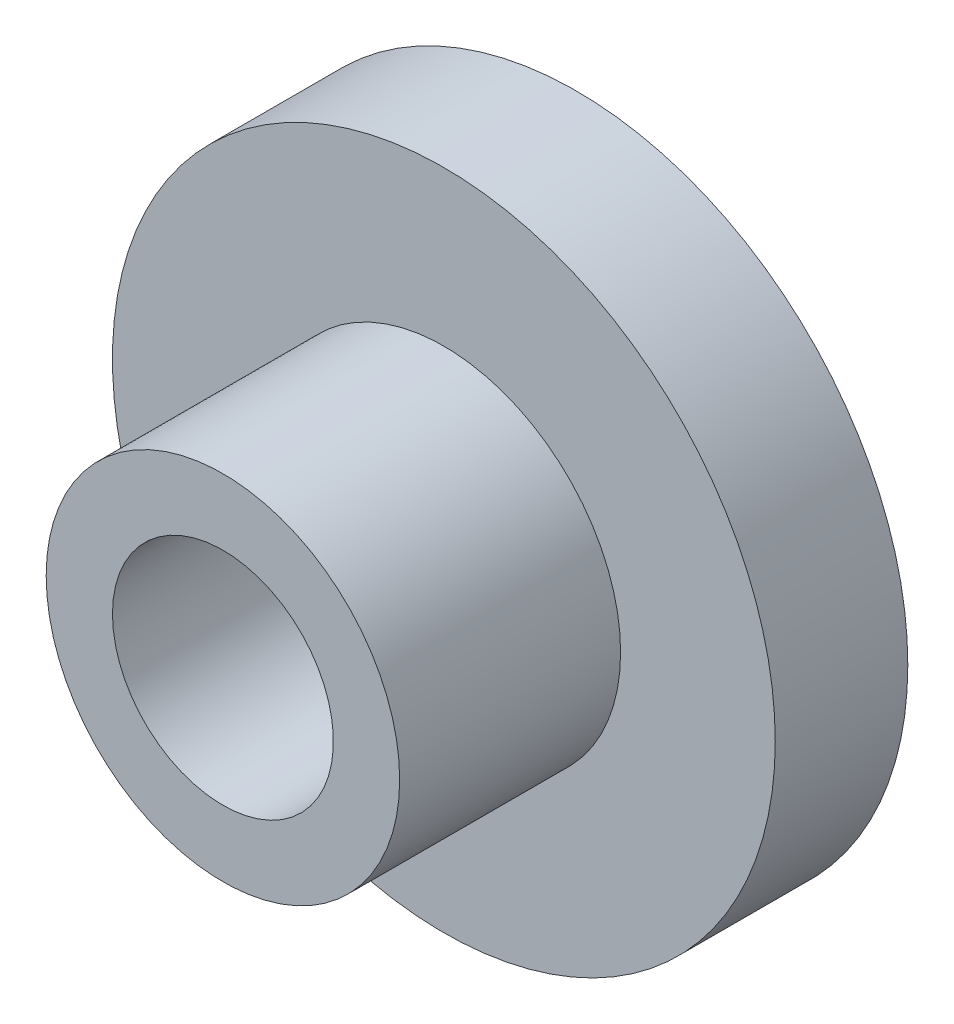
ISO-10303-21;
HEADER;
FILE_DESCRIPTION(('STEP AP214'),'2;1');
FILE_NAME('part.step','',(''),(''),'','','');
FILE_SCHEMA(('AUTOMOTIVE_DESIGN { 1 0 10303 214 1 1 1 1 }'));
ENDSEC;
DATA;
#1=APPLICATION_CONTEXT('core data for automotive mechanical design processes');
#2=APPLICATION_PROTOCOL_DEFINITION('international standard','automotive_design',2000,#1);
#3=PRODUCT_CONTEXT('',#1,'mechanical');
#4=PRODUCT('Part','Part','',(#3));
#5=PRODUCT_RELATED_PRODUCT_CATEGORY('part','',(#4));
#6=PRODUCT_DEFINITION_FORMATION('','',#4);
#7=PRODUCT_DEFINITION_CONTEXT('part definition',#1,'design');
#8=PRODUCT_DEFINITION('design','',#6,#7);
#9=PRODUCT_DEFINITION_SHAPE('','',#8);
#10=(LENGTH_UNIT() NAMED_UNIT(*) SI_UNIT(.MILLI.,.METRE.));
#11=(NAMED_UNIT(*) PLANE_ANGLE_UNIT() SI_UNIT($,.RADIAN.));
#12=(NAMED_UNIT(*) SI_UNIT($,.STERADIAN.) SOLID_ANGLE_UNIT());
#13=UNCERTAINTY_MEASURE_WITH_UNIT(LENGTH_MEASURE(1.E-05),#10,'distance_accuracy_value','');
#14=(GEOMETRIC_REPRESENTATION_CONTEXT(3) GLOBAL_UNCERTAINTY_ASSIGNED_CONTEXT((#13)) GLOBAL_UNIT_ASSIGNED_CONTEXT((#10,
#11,#12)) REPRESENTATION_CONTEXT('',''));
#15=CARTESIAN_POINT('',(0.,0.,0.));
#16=DIRECTION('',(0.,0.,1.));
#17=DIRECTION('',(1.,0.,0.));
#18=AXIS2_PLACEMENT_3D('',#15,#16,#17);
#19=CARTESIAN_POINT('',(0.,0.,3.));
#20=DIRECTION('',(0.,0.,-1.));
#21=DIRECTION('',(-1.,0.,0.));
#22=AXIS2_PLACEMENT_3D('',#19,#20,#21);
#23=CYLINDRICAL_SURFACE('',#22,7.5);
#24=CARTESIAN_POINT('',(0.,0.,3.));
#25=DIRECTION('',(0.,0.,1.));
#26=DIRECTION('',(1.,0.,0.));
#27=AXIS2_PLACEMENT_3D('',#24,#25,#26);
#28=CIRCLE('',#27,7.5);
#29=CARTESIAN_POINT('',(7.5,0.,3.));
#30=VERTEX_POINT('',#29);
#31=EDGE_CURVE('E37',#30,#30,#28,.T.);
#32=ORIENTED_EDGE('',*,*,#31,.F.);
#33=EDGE_LOOP('',(#32));
#34=FACE_BOUND('',#33,.T.);
#35=CARTESIAN_POINT('',(0.,0.,0.));
#36=DIRECTION('',(0.,0.,1.));
#37=DIRECTION('',(1.,0.,0.));
#38=AXIS2_PLACEMENT_3D('',#35,#36,#37);
#39=CIRCLE('',#38,7.5);
#40=CARTESIAN_POINT('',(7.5,0.,0.));
#41=VERTEX_POINT('',#40);
#42=EDGE_CURVE('E33',#41,#41,#39,.T.);
#43=ORIENTED_EDGE('',*,*,#42,.T.);
#44=EDGE_LOOP('',(#43));
#45=FACE_BOUND('',#44,.T.);
#46=ADVANCED_FACE('F30',(#34,#45),#23,.T.);
#47=CARTESIAN_POINT('',(0.,0.,3.));
#48=DIRECTION('',(0.,0.,1.));
#49=DIRECTION('',(1.,0.,0.));
#50=AXIS2_PLACEMENT_3D('',#47,#48,#49);
#51=PLANE('',#50);
#52=CARTESIAN_POINT('',(0.,0.,3.));
#53=DIRECTION('',(0.,0.,1.));
#54=DIRECTION('',(1.,0.,0.));
#55=AXIS2_PLACEMENT_3D('',#52,#53,#54);
#56=CIRCLE('',#55,4.);
#57=CARTESIAN_POINT('',(4.,0.,3.));
#58=VERTEX_POINT('',#57);
#59=EDGE_CURVE('E10',#58,#58,#56,.T.);
#60=ORIENTED_EDGE('',*,*,#59,.F.);
#61=EDGE_LOOP('',(#60));
#62=FACE_BOUND('',#61,.T.);
#63=ORIENTED_EDGE('',*,*,#31,.T.);
#64=EDGE_LOOP('',(#63));
#65=FACE_BOUND('',#64,.T.);
#66=ADVANCED_FACE('F66',(#62,#65),#51,.T.);
#67=CARTESIAN_POINT('',(0.,0.,0.));
#68=DIRECTION('',(0.,0.,1.));
#69=DIRECTION('',(1.,0.,0.));
#70=AXIS2_PLACEMENT_3D('',#67,#68,#69);
#71=PLANE('',#70);
#72=CARTESIAN_POINT('',(0.,0.,0.));
#73=DIRECTION('',(0.,0.,-1.));
#74=DIRECTION('',(-1.,0.,0.));
#75=AXIS2_PLACEMENT_3D('',#72,#73,#74);
#76=CIRCLE('',#75,2.5);
#77=CARTESIAN_POINT('',(-2.5,0.,0.));
#78=VERTEX_POINT('',#77);
#79=EDGE_CURVE('E47',#78,#78,#76,.T.);
#80=ORIENTED_EDGE('',*,*,#79,.F.);
#81=EDGE_LOOP('',(#80));
#82=FACE_BOUND('',#81,.T.);
#83=ORIENTED_EDGE('',*,*,#42,.F.);
#84=EDGE_LOOP('',(#83));
#85=FACE_BOUND('',#84,.T.);
#86=ADVANCED_FACE('F62',(#82,#85),#71,.F.);
#87=CARTESIAN_POINT('',(0.,0.,8.));
#88=DIRECTION('',(0.,0.,-1.));
#89=DIRECTION('',(-1.,0.,0.));
#90=AXIS2_PLACEMENT_3D('',#87,#88,#89);
#91=CYLINDRICAL_SURFACE('',#90,4.);
#92=CARTESIAN_POINT('',(0.,0.,8.));
#93=DIRECTION('',(0.,0.,1.));
#94=DIRECTION('',(1.,0.,0.));
#95=AXIS2_PLACEMENT_3D('',#92,#93,#94);
#96=CIRCLE('',#95,4.);
#97=CARTESIAN_POINT('',(4.,0.,8.));
#98=VERTEX_POINT('',#97);
#99=EDGE_CURVE('E43',#98,#98,#96,.T.);
#100=ORIENTED_EDGE('',*,*,#99,.F.);
#101=EDGE_LOOP('',(#100));
#102=FACE_BOUND('',#101,.T.);
#103=ORIENTED_EDGE('',*,*,#59,.T.);
#104=EDGE_LOOP('',(#103));
#105=FACE_BOUND('',#104,.T.);
#106=ADVANCED_FACE('F65',(#102,#105),#91,.T.);
#107=CARTESIAN_POINT('',(0.,0.,8.));
#108=DIRECTION('',(0.,0.,1.));
#109=DIRECTION('',(1.,0.,0.));
#110=AXIS2_PLACEMENT_3D('',#107,#108,#109);
#111=PLANE('',#110);
#112=CARTESIAN_POINT('',(0.,0.,8.));
#113=DIRECTION('',(0.,0.,-1.));
#114=DIRECTION('',(-1.,0.,0.));
#115=AXIS2_PLACEMENT_3D('',#112,#113,#114);
#116=CIRCLE('',#115,2.5);
#117=CARTESIAN_POINT('',(-2.5,0.,8.));
#118=VERTEX_POINT('',#117);
#119=EDGE_CURVE('E46',#118,#118,#116,.T.);
#120=ORIENTED_EDGE('',*,*,#119,.T.);
#121=EDGE_LOOP('',(#120));
#122=FACE_BOUND('',#121,.T.);
#123=ORIENTED_EDGE('',*,*,#99,.T.);
#124=EDGE_LOOP('',(#123));
#125=FACE_BOUND('',#124,.T.);
#126=ADVANCED_FACE('F53',(#122,#125),#111,.T.);
#127=CARTESIAN_POINT('',(0.,0.,8.));
#128=DIRECTION('',(0.,0.,-1.));
#129=DIRECTION('',(-1.,0.,0.));
#130=AXIS2_PLACEMENT_3D('',#127,#128,#129);
#131=CYLINDRICAL_SURFACE('',#130,2.5);
#132=ORIENTED_EDGE('',*,*,#119,.F.);
#133=EDGE_LOOP('',(#132));
#134=FACE_BOUND('',#133,.T.);
#135=ORIENTED_EDGE('',*,*,#79,.T.);
#136=EDGE_LOOP('',(#135));
#137=FACE_BOUND('',#136,.T.);
#138=ADVANCED_FACE('F56',(#134,#137),#131,.F.);
#139=CLOSED_SHELL('',(#46,#66,#86,#106,#126,#138));
#140=MANIFOLD_SOLID_BREP('B2',#139);
#141=ADVANCED_BREP_SHAPE_REPRESENTATION('',(#18,#140),#14);
#142=SHAPE_DEFINITION_REPRESENTATION(#9,#141);
ENDSEC;
END-ISO-10303-21;
